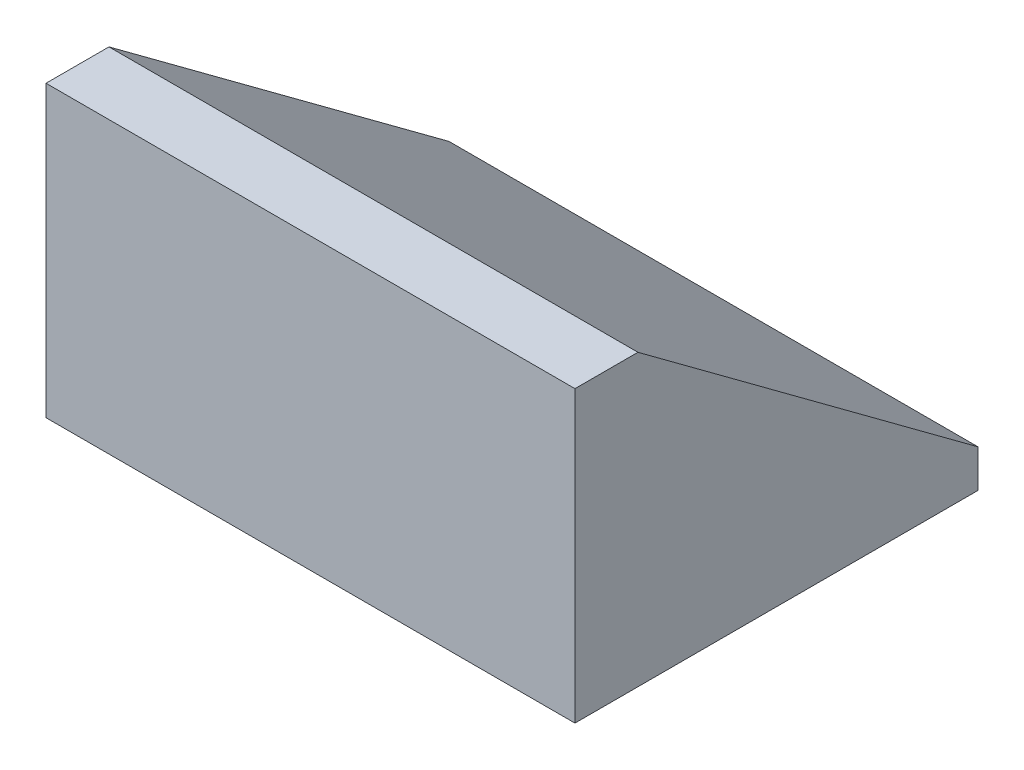
ISO-10303-21;
HEADER;
FILE_DESCRIPTION(('STEP AP214'),'2;1');
FILE_NAME('part.step','',(''),(''),'','','');
FILE_SCHEMA(('AUTOMOTIVE_DESIGN { 1 0 10303 214 1 1 1 1 }'));
ENDSEC;
DATA;
#1=APPLICATION_CONTEXT('core data for automotive mechanical design processes');
#2=APPLICATION_PROTOCOL_DEFINITION('international standard','automotive_design',2000,#1);
#3=PRODUCT_CONTEXT('',#1,'mechanical');
#4=PRODUCT('Part','Part','',(#3));
#5=PRODUCT_RELATED_PRODUCT_CATEGORY('part','',(#4));
#6=PRODUCT_DEFINITION_FORMATION('','',#4);
#7=PRODUCT_DEFINITION_CONTEXT('part definition',#1,'design');
#8=PRODUCT_DEFINITION('design','',#6,#7);
#9=PRODUCT_DEFINITION_SHAPE('','',#8);
#10=(LENGTH_UNIT() NAMED_UNIT(*) SI_UNIT(.MILLI.,.METRE.));
#11=(NAMED_UNIT(*) PLANE_ANGLE_UNIT() SI_UNIT($,.RADIAN.));
#12=(NAMED_UNIT(*) SI_UNIT($,.STERADIAN.) SOLID_ANGLE_UNIT());
#13=UNCERTAINTY_MEASURE_WITH_UNIT(LENGTH_MEASURE(1.E-05),#10,'distance_accuracy_value','');
#14=(GEOMETRIC_REPRESENTATION_CONTEXT(3) GLOBAL_UNCERTAINTY_ASSIGNED_CONTEXT((#13)) GLOBAL_UNIT_ASSIGNED_CONTEXT((#10,
#11,#12)) REPRESENTATION_CONTEXT('',''));
#15=CARTESIAN_POINT('',(0.,0.,0.));
#16=DIRECTION('',(0.,0.,1.));
#17=DIRECTION('',(1.,0.,0.));
#18=AXIS2_PLACEMENT_3D('',#15,#16,#17);
#19=CARTESIAN_POINT('',(-21.,11.5,-42.));
#20=DIRECTION('',(-1.,0.,0.));
#21=DIRECTION('',(0.,-1.,0.));
#22=AXIS2_PLACEMENT_3D('',#19,#20,#21);
#23=PLANE('',#22);
#24=DIRECTION('',(0.,0.595227550625738,0.803557193344746));
#25=VECTOR('',#24,1.);
#26=CARTESIAN_POINT('',(-21.,-8.5,-42.));
#27=LINE('',#26,#25);
#28=CARTESIAN_POINT('',(-21.,-8.5,-42.));
#29=VERTEX_POINT('',#28);
#30=CARTESIAN_POINT('',(-21.,11.5,-15.));
#31=VERTEX_POINT('',#30);
#32=EDGE_CURVE('E123',#29,#31,#27,.T.);
#33=ORIENTED_EDGE('',*,*,#32,.F.);
#34=DIRECTION('',(0.,-1.,0.));
#35=VECTOR('',#34,1.);
#36=CARTESIAN_POINT('',(-21.,11.5,-42.));
#37=LINE('',#36,#35);
#38=CARTESIAN_POINT('',(-21.,-11.5,-42.));
#39=VERTEX_POINT('',#38);
#40=EDGE_CURVE('E101',#29,#39,#37,.T.);
#41=ORIENTED_EDGE('',*,*,#40,.T.);
#42=DIRECTION('',(0.,0.,1.));
#43=VECTOR('',#42,1.);
#44=CARTESIAN_POINT('',(-21.,-11.5,-42.));
#45=LINE('',#44,#43);
#46=CARTESIAN_POINT('',(-21.,-11.5,-10.));
#47=VERTEX_POINT('',#46);
#48=EDGE_CURVE('E40',#39,#47,#45,.T.);
#49=ORIENTED_EDGE('',*,*,#48,.T.);
#50=DIRECTION('',(0.,-1.,0.));
#51=VECTOR('',#50,1.);
#52=CARTESIAN_POINT('',(-21.,11.5,-10.));
#53=LINE('',#52,#51);
#54=CARTESIAN_POINT('',(-21.,11.5,-10.));
#55=VERTEX_POINT('',#54);
#56=EDGE_CURVE('E91',#55,#47,#53,.T.);
#57=ORIENTED_EDGE('',*,*,#56,.F.);
#58=DIRECTION('',(0.,0.,1.));
#59=VECTOR('',#58,1.);
#60=CARTESIAN_POINT('',(-21.,11.5,-42.));
#61=LINE('',#60,#59);
#62=EDGE_CURVE('E11',#31,#55,#61,.T.);
#63=ORIENTED_EDGE('',*,*,#62,.F.);
#64=EDGE_LOOP('',(#33,#41,#49,#57,#63));
#65=FACE_BOUND('',#64,.T.);
#66=ADVANCED_FACE('F37',(#65),#23,.T.);
#67=CARTESIAN_POINT('',(21.,11.5,-42.));
#68=DIRECTION('',(0.,1.,0.));
#69=DIRECTION('',(-1.,0.,0.));
#70=AXIS2_PLACEMENT_3D('',#67,#68,#69);
#71=PLANE('',#70);
#72=DIRECTION('',(-1.,0.,0.));
#73=VECTOR('',#72,1.);
#74=CARTESIAN_POINT('',(21.,11.5,-15.));
#75=LINE('',#74,#73);
#76=CARTESIAN_POINT('',(21.,11.5,-15.));
#77=VERTEX_POINT('',#76);
#78=EDGE_CURVE('E87',#77,#31,#75,.T.);
#79=ORIENTED_EDGE('',*,*,#78,.T.);
#80=ORIENTED_EDGE('',*,*,#62,.T.);
#81=DIRECTION('',(-1.,0.,0.));
#82=VECTOR('',#81,1.);
#83=CARTESIAN_POINT('',(21.,11.5,-10.));
#84=LINE('',#83,#82);
#85=CARTESIAN_POINT('',(21.,11.5,-10.));
#86=VERTEX_POINT('',#85);
#87=EDGE_CURVE('E85',#86,#55,#84,.T.);
#88=ORIENTED_EDGE('',*,*,#87,.F.);
#89=DIRECTION('',(0.,0.,1.));
#90=VECTOR('',#89,1.);
#91=CARTESIAN_POINT('',(21.,11.5,-42.));
#92=LINE('',#91,#90);
#93=EDGE_CURVE('E45',#77,#86,#92,.T.);
#94=ORIENTED_EDGE('',*,*,#93,.F.);
#95=EDGE_LOOP('',(#79,#80,#88,#94));
#96=FACE_BOUND('',#95,.T.);
#97=ADVANCED_FACE('F82',(#96),#71,.T.);
#98=CARTESIAN_POINT('',(21.,11.5,-42.));
#99=DIRECTION('',(1.,0.,0.));
#100=DIRECTION('',(0.,0.,-1.));
#101=AXIS2_PLACEMENT_3D('',#98,#99,#100);
#102=PLANE('',#101);
#103=DIRECTION('',(0.,0.595227550625738,0.803557193344746));
#104=VECTOR('',#103,1.);
#105=CARTESIAN_POINT('',(21.,-8.49999999999999,-42.));
#106=LINE('',#105,#104);
#107=CARTESIAN_POINT('',(21.,-8.49999999999999,-42.));
#108=VERTEX_POINT('',#107);
#109=EDGE_CURVE('E53',#108,#77,#106,.T.);
#110=ORIENTED_EDGE('',*,*,#109,.T.);
#111=ORIENTED_EDGE('',*,*,#93,.T.);
#112=DIRECTION('',(0.,1.,0.));
#113=VECTOR('',#112,1.);
#114=CARTESIAN_POINT('',(21.,11.5,-10.));
#115=LINE('',#114,#113);
#116=CARTESIAN_POINT('',(21.,-11.5,-10.));
#117=VERTEX_POINT('',#116);
#118=EDGE_CURVE('E100',#117,#86,#115,.T.);
#119=ORIENTED_EDGE('',*,*,#118,.F.);
#120=DIRECTION('',(0.,0.,1.));
#121=VECTOR('',#120,1.);
#122=CARTESIAN_POINT('',(21.,-11.5,-42.));
#123=LINE('',#122,#121);
#124=CARTESIAN_POINT('',(21.,-11.5,-42.));
#125=VERTEX_POINT('',#124);
#126=EDGE_CURVE('E62',#125,#117,#123,.T.);
#127=ORIENTED_EDGE('',*,*,#126,.F.);
#128=DIRECTION('',(0.,1.,0.));
#129=VECTOR('',#128,1.);
#130=CARTESIAN_POINT('',(21.,11.5,-42.));
#131=LINE('',#130,#129);
#132=EDGE_CURVE('E110',#125,#108,#131,.T.);
#133=ORIENTED_EDGE('',*,*,#132,.T.);
#134=EDGE_LOOP('',(#110,#111,#119,#127,#133));
#135=FACE_BOUND('',#134,.T.);
#136=ADVANCED_FACE('F129',(#135),#102,.T.);
#137=CARTESIAN_POINT('',(21.,-11.5,-42.));
#138=DIRECTION('',(0.,-1.,0.));
#139=DIRECTION('',(1.,0.,0.));
#140=AXIS2_PLACEMENT_3D('',#137,#138,#139);
#141=PLANE('',#140);
#142=DIRECTION('',(1.,0.,0.));
#143=VECTOR('',#142,1.);
#144=CARTESIAN_POINT('',(21.,-11.5,-10.));
#145=LINE('',#144,#143);
#146=EDGE_CURVE('E96',#47,#117,#145,.T.);
#147=ORIENTED_EDGE('',*,*,#146,.F.);
#148=ORIENTED_EDGE('',*,*,#48,.F.);
#149=DIRECTION('',(1.,0.,0.));
#150=VECTOR('',#149,1.);
#151=CARTESIAN_POINT('',(21.,-11.5,-42.));
#152=LINE('',#151,#150);
#153=EDGE_CURVE('E103',#39,#125,#152,.T.);
#154=ORIENTED_EDGE('',*,*,#153,.T.);
#155=ORIENTED_EDGE('',*,*,#126,.T.);
#156=EDGE_LOOP('',(#147,#148,#154,#155));
#157=FACE_BOUND('',#156,.T.);
#158=ADVANCED_FACE('F113',(#157),#141,.T.);
#159=CARTESIAN_POINT('',(0.,0.,-42.));
#160=DIRECTION('',(0.,0.,-1.));
#161=DIRECTION('',(-1.,0.,0.));
#162=AXIS2_PLACEMENT_3D('',#159,#160,#161);
#163=PLANE('',#162);
#164=DIRECTION('',(-1.,0.,0.));
#165=VECTOR('',#164,1.);
#166=CARTESIAN_POINT('',(21.,-8.49999999999999,-42.));
#167=LINE('',#166,#165);
#168=EDGE_CURVE('E119',#108,#29,#167,.T.);
#169=ORIENTED_EDGE('',*,*,#168,.F.);
#170=ORIENTED_EDGE('',*,*,#132,.F.);
#171=ORIENTED_EDGE('',*,*,#153,.F.);
#172=ORIENTED_EDGE('',*,*,#40,.F.);
#173=EDGE_LOOP('',(#169,#170,#171,#172));
#174=FACE_BOUND('',#173,.T.);
#175=ADVANCED_FACE('F117',(#174),#163,.T.);
#176=CARTESIAN_POINT('',(0.,0.,-10.));
#177=DIRECTION('',(0.,0.,-1.));
#178=DIRECTION('',(-1.,0.,0.));
#179=AXIS2_PLACEMENT_3D('',#176,#177,#178);
#180=PLANE('',#179);
#181=ORIENTED_EDGE('',*,*,#56,.T.);
#182=ORIENTED_EDGE('',*,*,#146,.T.);
#183=ORIENTED_EDGE('',*,*,#118,.T.);
#184=ORIENTED_EDGE('',*,*,#87,.T.);
#185=EDGE_LOOP('',(#181,#182,#183,#184));
#186=FACE_BOUND('',#185,.T.);
#187=ADVANCED_FACE('F99',(#186),#180,.F.);
#188=CARTESIAN_POINT('',(21.,-8.49999999999999,-42.));
#189=DIRECTION('',(0.,-0.803557193344746,0.595227550625738));
#190=DIRECTION('',(0.,-0.595227550625738,-0.803557193344746));
#191=AXIS2_PLACEMENT_3D('',#188,#189,#190);
#192=PLANE('',#191);
#193=ORIENTED_EDGE('',*,*,#32,.T.);
#194=ORIENTED_EDGE('',*,*,#78,.F.);
#195=ORIENTED_EDGE('',*,*,#109,.F.);
#196=ORIENTED_EDGE('',*,*,#168,.T.);
#197=EDGE_LOOP('',(#193,#194,#195,#196));
#198=FACE_BOUND('',#197,.T.);
#199=ADVANCED_FACE('F126',(#198),#192,.F.);
#200=CLOSED_SHELL('',(#66,#97,#136,#158,#175,#187,#199));
#201=MANIFOLD_SOLID_BREP('B2',#200);
#202=ADVANCED_BREP_SHAPE_REPRESENTATION('',(#18,#201),#14);
#203=SHAPE_DEFINITION_REPRESENTATION(#9,#202);
ENDSEC;
END-ISO-10303-21;
